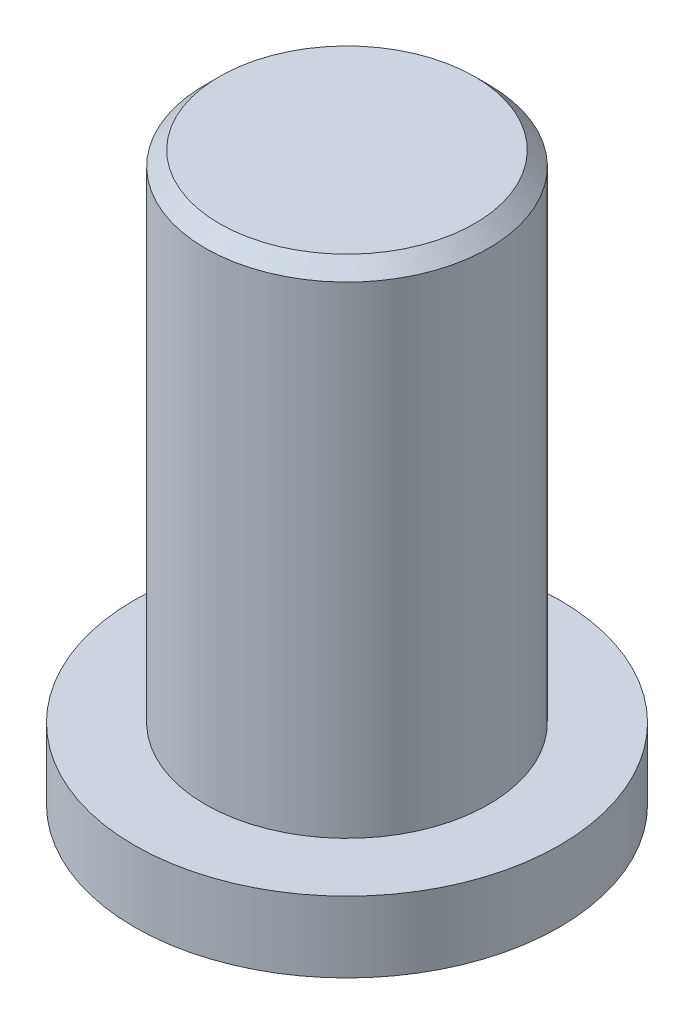
ISO-10303-21;
HEADER;
FILE_DESCRIPTION(('STEP AP214'),'2;1');
FILE_NAME('part.step','',(''),(''),'','','');
FILE_SCHEMA(('AUTOMOTIVE_DESIGN { 1 0 10303 214 1 1 1 1 }'));
ENDSEC;
DATA;
#1=APPLICATION_CONTEXT('core data for automotive mechanical design processes');
#2=APPLICATION_PROTOCOL_DEFINITION('international standard','automotive_design',2000,#1);
#3=PRODUCT_CONTEXT('',#1,'mechanical');
#4=PRODUCT('Part','Part','',(#3));
#5=PRODUCT_RELATED_PRODUCT_CATEGORY('part','',(#4));
#6=PRODUCT_DEFINITION_FORMATION('','',#4);
#7=PRODUCT_DEFINITION_CONTEXT('part definition',#1,'design');
#8=PRODUCT_DEFINITION('design','',#6,#7);
#9=PRODUCT_DEFINITION_SHAPE('','',#8);
#10=(LENGTH_UNIT() NAMED_UNIT(*) SI_UNIT(.MILLI.,.METRE.));
#11=(NAMED_UNIT(*) PLANE_ANGLE_UNIT() SI_UNIT($,.RADIAN.));
#12=(NAMED_UNIT(*) SI_UNIT($,.STERADIAN.) SOLID_ANGLE_UNIT());
#13=UNCERTAINTY_MEASURE_WITH_UNIT(LENGTH_MEASURE(1.E-05),#10,'distance_accuracy_value','');
#14=(GEOMETRIC_REPRESENTATION_CONTEXT(3) GLOBAL_UNCERTAINTY_ASSIGNED_CONTEXT((#13)) GLOBAL_UNIT_ASSIGNED_CONTEXT((#10,
#11,#12)) REPRESENTATION_CONTEXT('',''));
#15=CARTESIAN_POINT('',(0.,0.,0.));
#16=DIRECTION('',(0.,0.,1.));
#17=DIRECTION('',(1.,0.,0.));
#18=AXIS2_PLACEMENT_3D('',#15,#16,#17);
#19=CARTESIAN_POINT('',(0.,5.,0.));
#20=DIRECTION('',(0.,-1.,0.));
#21=DIRECTION('',(0.,0.,-1.));
#22=AXIS2_PLACEMENT_3D('',#19,#20,#21);
#23=CYLINDRICAL_SURFACE('',#22,15.);
#24=CARTESIAN_POINT('',(0.,5.,0.));
#25=DIRECTION('',(0.,1.,0.));
#26=DIRECTION('',(0.,0.,1.));
#27=AXIS2_PLACEMENT_3D('',#24,#25,#26);
#28=CIRCLE('',#27,15.);
#29=CARTESIAN_POINT('',(0.,5.,15.));
#30=VERTEX_POINT('',#29);
#31=EDGE_CURVE('E53',#30,#30,#28,.T.);
#32=ORIENTED_EDGE('',*,*,#31,.F.);
#33=EDGE_LOOP('',(#32));
#34=FACE_BOUND('',#33,.T.);
#35=CARTESIAN_POINT('',(0.,0.,0.));
#36=DIRECTION('',(0.,1.,0.));
#37=DIRECTION('',(0.,0.,1.));
#38=AXIS2_PLACEMENT_3D('',#35,#36,#37);
#39=CIRCLE('',#38,15.);
#40=CARTESIAN_POINT('',(0.,0.,15.));
#41=VERTEX_POINT('',#40);
#42=EDGE_CURVE('E56',#41,#41,#39,.T.);
#43=ORIENTED_EDGE('',*,*,#42,.T.);
#44=EDGE_LOOP('',(#43));
#45=FACE_BOUND('',#44,.T.);
#46=ADVANCED_FACE('F37',(#34,#45),#23,.T.);
#47=CARTESIAN_POINT('',(0.,5.,0.));
#48=DIRECTION('',(0.,1.,0.));
#49=DIRECTION('',(0.,0.,1.));
#50=AXIS2_PLACEMENT_3D('',#47,#48,#49);
#51=PLANE('',#50);
#52=CARTESIAN_POINT('',(0.,5.,0.));
#53=DIRECTION('',(0.,1.,0.));
#54=DIRECTION('',(0.,0.,1.));
#55=AXIS2_PLACEMENT_3D('',#52,#53,#54);
#56=CIRCLE('',#55,10.);
#57=CARTESIAN_POINT('',(0.,5.,10.));
#58=VERTEX_POINT('',#57);
#59=EDGE_CURVE('E49',#58,#58,#56,.T.);
#60=ORIENTED_EDGE('',*,*,#59,.F.);
#61=EDGE_LOOP('',(#60));
#62=FACE_BOUND('',#61,.T.);
#63=ORIENTED_EDGE('',*,*,#31,.T.);
#64=EDGE_LOOP('',(#63));
#65=FACE_BOUND('',#64,.T.);
#66=ADVANCED_FACE('F62',(#62,#65),#51,.T.);
#67=CARTESIAN_POINT('',(0.,0.,0.));
#68=DIRECTION('',(0.,1.,0.));
#69=DIRECTION('',(0.,0.,1.));
#70=AXIS2_PLACEMENT_3D('',#67,#68,#69);
#71=PLANE('',#70);
#72=ORIENTED_EDGE('',*,*,#42,.F.);
#73=EDGE_LOOP('',(#72));
#74=FACE_BOUND('',#73,.T.);
#75=ADVANCED_FACE('F68',(#74),#71,.F.);
#76=CARTESIAN_POINT('',(0.,40.,0.));
#77=DIRECTION('',(0.,-1.,0.));
#78=DIRECTION('',(0.,0.,-1.));
#79=AXIS2_PLACEMENT_3D('',#76,#77,#78);
#80=CYLINDRICAL_SURFACE('',#79,10.);
#81=CARTESIAN_POINT('',(0.,39.,0.));
#82=DIRECTION('',(0.,1.,0.));
#83=DIRECTION('',(0.,0.,1.));
#84=AXIS2_PLACEMENT_3D('',#81,#82,#83);
#85=CIRCLE('',#84,10.);
#86=CARTESIAN_POINT('',(0.,39.,10.));
#87=VERTEX_POINT('',#86);
#88=EDGE_CURVE('E10',#87,#87,#85,.F.);
#89=ORIENTED_EDGE('',*,*,#88,.T.);
#90=EDGE_LOOP('',(#89));
#91=FACE_BOUND('',#90,.T.);
#92=ORIENTED_EDGE('',*,*,#59,.T.);
#93=EDGE_LOOP('',(#92));
#94=FACE_BOUND('',#93,.T.);
#95=ADVANCED_FACE('F70',(#91,#94),#80,.T.);
#96=CARTESIAN_POINT('',(0.,40.,0.));
#97=DIRECTION('',(0.,1.,0.));
#98=DIRECTION('',(0.,0.,1.));
#99=AXIS2_PLACEMENT_3D('',#96,#97,#98);
#100=PLANE('',#99);
#101=CARTESIAN_POINT('',(0.,40.,0.));
#102=DIRECTION('',(0.,1.,0.));
#103=DIRECTION('',(0.,0.,1.));
#104=AXIS2_PLACEMENT_3D('',#101,#102,#103);
#105=CIRCLE('',#104,8.99999999999999);
#106=CARTESIAN_POINT('',(0.,40.,8.99999999999999));
#107=VERTEX_POINT('',#106);
#108=EDGE_CURVE('E45',#107,#107,#105,.T.);
#109=ORIENTED_EDGE('',*,*,#108,.T.);
#110=EDGE_LOOP('',(#109));
#111=FACE_BOUND('',#110,.T.);
#112=ADVANCED_FACE('F76',(#111),#100,.T.);
#113=CARTESIAN_POINT('',(0.,40.,0.));
#114=DIRECTION('',(0.,-1.,0.));
#115=DIRECTION('',(0.,0.,-1.));
#116=AXIS2_PLACEMENT_3D('',#113,#114,#115);
#117=CONICAL_SURFACE('',#116,8.99999999999999,0.785398163397447);
#118=ORIENTED_EDGE('',*,*,#88,.F.);
#119=EDGE_LOOP('',(#118));
#120=FACE_BOUND('',#119,.T.);
#121=ORIENTED_EDGE('',*,*,#108,.F.);
#122=EDGE_LOOP('',(#121));
#123=FACE_BOUND('',#122,.T.);
#124=ADVANCED_FACE('F40',(#120,#123),#117,.T.);
#125=CLOSED_SHELL('',(#46,#66,#75,#95,#112,#124));
#126=MANIFOLD_SOLID_BREP('B2',#125);
#127=ADVANCED_BREP_SHAPE_REPRESENTATION('',(#18,#126),#14);
#128=SHAPE_DEFINITION_REPRESENTATION(#9,#127);
ENDSEC;
END-ISO-10303-21;
